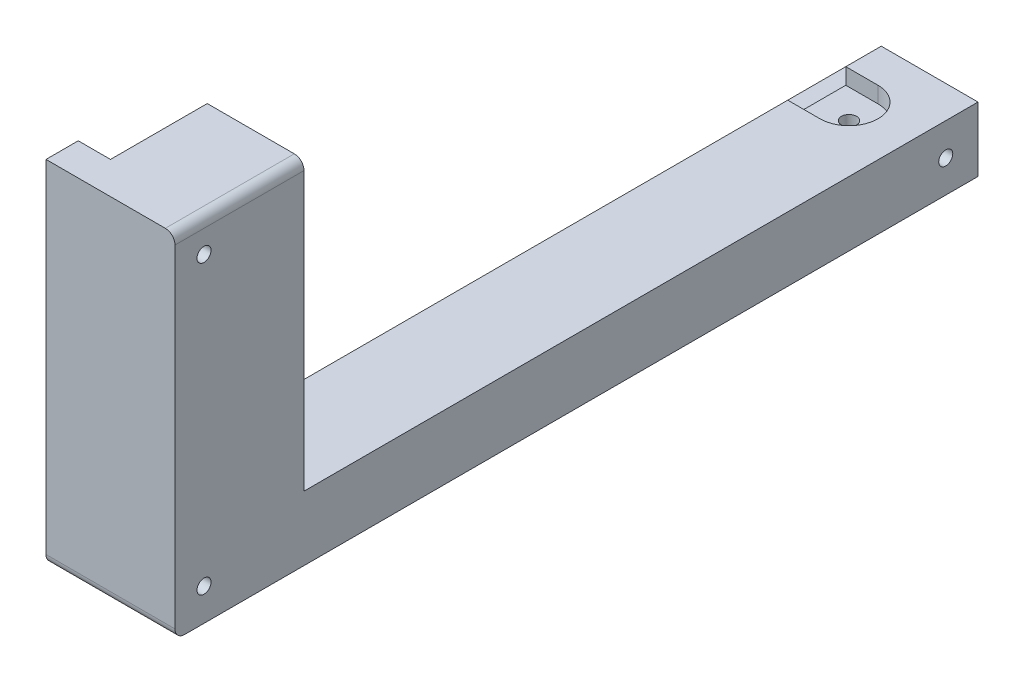
ISO-10303-21;
HEADER;
FILE_DESCRIPTION(('STEP AP214'),'2;1');
FILE_NAME('part.step','',(''),(''),'','','');
FILE_SCHEMA(('AUTOMOTIVE_DESIGN { 1 0 10303 214 1 1 1 1 }'));
ENDSEC;
DATA;
#1=APPLICATION_CONTEXT('core data for automotive mechanical design processes');
#2=APPLICATION_PROTOCOL_DEFINITION('international standard','automotive_design',2000,#1);
#3=PRODUCT_CONTEXT('',#1,'mechanical');
#4=PRODUCT('Part','Part','',(#3));
#5=PRODUCT_RELATED_PRODUCT_CATEGORY('part','',(#4));
#6=PRODUCT_DEFINITION_FORMATION('','',#4);
#7=PRODUCT_DEFINITION_CONTEXT('part definition',#1,'design');
#8=PRODUCT_DEFINITION('design','',#6,#7);
#9=PRODUCT_DEFINITION_SHAPE('','',#8);
#10=(LENGTH_UNIT() NAMED_UNIT(*) SI_UNIT(.MILLI.,.METRE.));
#11=(NAMED_UNIT(*) PLANE_ANGLE_UNIT() SI_UNIT($,.RADIAN.));
#12=(NAMED_UNIT(*) SI_UNIT($,.STERADIAN.) SOLID_ANGLE_UNIT());
#13=UNCERTAINTY_MEASURE_WITH_UNIT(LENGTH_MEASURE(1.E-05),#10,'distance_accuracy_value','');
#14=(GEOMETRIC_REPRESENTATION_CONTEXT(3) GLOBAL_UNCERTAINTY_ASSIGNED_CONTEXT((#13)) GLOBAL_UNIT_ASSIGNED_CONTEXT((#10,
#11,#12)) REPRESENTATION_CONTEXT('',''));
#15=CARTESIAN_POINT('',(0.,0.,0.));
#16=DIRECTION('',(0.,0.,1.));
#17=DIRECTION('',(1.,0.,0.));
#18=AXIS2_PLACEMENT_3D('',#15,#16,#17);
#19=CARTESIAN_POINT('',(0.,-3.00000000000001,105.5));
#20=DIRECTION('',(0.,1.,0.));
#21=DIRECTION('',(0.,0.,1.));
#22=AXIS2_PLACEMENT_3D('',#19,#20,#21);
#23=CYLINDRICAL_SURFACE('',#22,2.35);
#24=CARTESIAN_POINT('',(0.,0.,105.5));
#25=DIRECTION('',(0.,-1.,0.));
#26=DIRECTION('',(0.,0.,-1.));
#27=AXIS2_PLACEMENT_3D('',#24,#25,#26);
#28=CIRCLE('',#27,2.35);
#29=CARTESIAN_POINT('',(0.,0.,103.15));
#30=VERTEX_POINT('',#29);
#31=EDGE_CURVE('E247',#30,#30,#28,.T.);
#32=ORIENTED_EDGE('',*,*,#31,.T.);
#33=EDGE_LOOP('',(#32));
#34=FACE_BOUND('',#33,.T.);
#35=CARTESIAN_POINT('',(0.,15.,105.5));
#36=DIRECTION('',(0.,1.,0.));
#37=DIRECTION('',(0.,0.,1.));
#38=AXIS2_PLACEMENT_3D('',#35,#36,#37);
#39=CIRCLE('',#38,2.35);
#40=CARTESIAN_POINT('',(0.,15.,107.85));
#41=VERTEX_POINT('',#40);
#42=EDGE_CURVE('E245',#41,#41,#39,.F.);
#43=ORIENTED_EDGE('',*,*,#42,.F.);
#44=EDGE_LOOP('',(#43));
#45=FACE_BOUND('',#44,.T.);
#46=ADVANCED_FACE('F37',(#34,#45),#23,.F.);
#47=CARTESIAN_POINT('',(0.,-3.00000000000001,-104.5));
#48=DIRECTION('',(0.,1.,0.));
#49=DIRECTION('',(0.,0.,1.));
#50=AXIS2_PLACEMENT_3D('',#47,#48,#49);
#51=CYLINDRICAL_SURFACE('',#50,2.35);
#52=CARTESIAN_POINT('',(0.,0.,-104.5));
#53=DIRECTION('',(0.,-1.,0.));
#54=DIRECTION('',(0.,0.,-1.));
#55=AXIS2_PLACEMENT_3D('',#52,#53,#54);
#56=CIRCLE('',#55,2.35);
#57=CARTESIAN_POINT('',(0.,0.,-106.85));
#58=VERTEX_POINT('',#57);
#59=EDGE_CURVE('E262',#58,#58,#56,.T.);
#60=ORIENTED_EDGE('',*,*,#59,.T.);
#61=EDGE_LOOP('',(#60));
#62=FACE_BOUND('',#61,.T.);
#63=CARTESIAN_POINT('',(0.,15.,-104.5));
#64=DIRECTION('',(0.,1.,0.));
#65=DIRECTION('',(0.,0.,1.));
#66=AXIS2_PLACEMENT_3D('',#63,#64,#65);
#67=CIRCLE('',#66,2.35);
#68=CARTESIAN_POINT('',(0.,15.,-102.15));
#69=VERTEX_POINT('',#68);
#70=EDGE_CURVE('E220',#69,#69,#67,.F.);
#71=ORIENTED_EDGE('',*,*,#70,.F.);
#72=EDGE_LOOP('',(#71));
#73=FACE_BOUND('',#72,.T.);
#74=ADVANCED_FACE('F426',(#62,#73),#51,.F.);
#75=CARTESIAN_POINT('',(-10.,120.,-124.5));
#76=DIRECTION('',(-1.,0.,0.));
#77=DIRECTION('',(0.,0.,1.));
#78=AXIS2_PLACEMENT_3D('',#75,#76,#77);
#79=PLANE('',#78);
#80=DIRECTION('',(0.,1.,0.));
#81=VECTOR('',#80,1.);
#82=CARTESIAN_POINT('',(-9.99999999999997,15.,-95.5));
#83=LINE('',#82,#81);
#84=CARTESIAN_POINT('',(-9.99999999999997,15.,-95.5));
#85=VERTEX_POINT('',#84);
#86=CARTESIAN_POINT('',(-9.99999999999997,20.,-95.5));
#87=VERTEX_POINT('',#86);
#88=EDGE_CURVE('E221',#85,#87,#83,.T.);
#89=ORIENTED_EDGE('',*,*,#88,.F.);
#90=DIRECTION('',(0.,0.,1.));
#91=VECTOR('',#90,1.);
#92=CARTESIAN_POINT('',(-9.99999999999997,15.,-95.5));
#93=LINE('',#92,#91);
#94=CARTESIAN_POINT('',(-9.99999999999997,15.,-113.5));
#95=VERTEX_POINT('',#94);
#96=EDGE_CURVE('E199',#95,#85,#93,.T.);
#97=ORIENTED_EDGE('',*,*,#96,.F.);
#98=DIRECTION('',(0.,1.,0.));
#99=VECTOR('',#98,1.);
#100=CARTESIAN_POINT('',(-9.99999999999997,15.,-113.5));
#101=LINE('',#100,#99);
#102=CARTESIAN_POINT('',(-9.99999999999997,20.,-113.5));
#103=VERTEX_POINT('',#102);
#104=EDGE_CURVE('E190',#95,#103,#101,.T.);
#105=ORIENTED_EDGE('',*,*,#104,.T.);
#106=DIRECTION('',(0.,0.,-1.));
#107=VECTOR('',#106,1.);
#108=CARTESIAN_POINT('',(-9.99999999999998,20.,0.));
#109=LINE('',#108,#107);
#110=CARTESIAN_POINT('',(-10.,20.,-124.5));
#111=VERTEX_POINT('',#110);
#112=EDGE_CURVE('E292',#103,#111,#109,.T.);
#113=ORIENTED_EDGE('',*,*,#112,.T.);
#114=DIRECTION('',(0.,-1.,0.));
#115=VECTOR('',#114,1.);
#116=CARTESIAN_POINT('',(-10.,120.,-124.5));
#117=LINE('',#116,#115);
#118=CARTESIAN_POINT('',(-10.,10.,-124.5));
#119=VERTEX_POINT('',#118);
#120=EDGE_CURVE('E287',#111,#119,#117,.T.);
#121=ORIENTED_EDGE('',*,*,#120,.T.);
#122=DIRECTION('',(0.,0.,-1.));
#123=VECTOR('',#122,1.);
#124=CARTESIAN_POINT('',(-10.,10.,-124.5));
#125=LINE('',#124,#123);
#126=CARTESIAN_POINT('',(-9.99999999999997,10.,114.5));
#127=VERTEX_POINT('',#126);
#128=EDGE_CURVE('E266',#127,#119,#125,.T.);
#129=ORIENTED_EDGE('',*,*,#128,.F.);
#130=DIRECTION('',(0.,-1.,0.));
#131=VECTOR('',#130,1.);
#132=CARTESIAN_POINT('',(-9.99999999999997,120.,114.5));
#133=LINE('',#132,#131);
#134=CARTESIAN_POINT('',(-9.99999999999997,15.,114.5));
#135=VERTEX_POINT('',#134);
#136=EDGE_CURVE('E281',#135,#127,#133,.T.);
#137=ORIENTED_EDGE('',*,*,#136,.F.);
#138=DIRECTION('',(0.,0.,-1.));
#139=VECTOR('',#138,1.);
#140=CARTESIAN_POINT('',(-10.,15.,-124.5));
#141=LINE('',#140,#139);
#142=CARTESIAN_POINT('',(-9.99999999999997,15.,96.5));
#143=VERTEX_POINT('',#142);
#144=EDGE_CURVE('E241',#135,#143,#141,.T.);
#145=ORIENTED_EDGE('',*,*,#144,.T.);
#146=DIRECTION('',(0.,-1.,0.));
#147=VECTOR('',#146,1.);
#148=CARTESIAN_POINT('',(-9.99999999999997,120.,96.5));
#149=LINE('',#148,#147);
#150=CARTESIAN_POINT('',(-10.,20.,96.5));
#151=VERTEX_POINT('',#150);
#152=EDGE_CURVE('E244',#151,#143,#149,.T.);
#153=ORIENTED_EDGE('',*,*,#152,.F.);
#154=EDGE_CURVE('E294',#151,#87,#109,.T.);
#155=ORIENTED_EDGE('',*,*,#154,.T.);
#156=EDGE_LOOP('',(#89,#97,#105,#113,#121,#129,#137,#145,#153,#155));
#157=FACE_BOUND('',#156,.T.);
#158=ADVANCED_FACE('F391',(#157),#79,.T.);
#159=CARTESIAN_POINT('',(0.,20.,0.));
#160=DIRECTION('',(0.,-1.,0.));
#161=DIRECTION('',(0.,0.,-1.));
#162=AXIS2_PLACEMENT_3D('',#159,#160,#161);
#163=PLANE('',#162);
#164=CARTESIAN_POINT('',(0.,20.,-104.5));
#165=DIRECTION('',(0.,1.,0.));
#166=DIRECTION('',(0.,0.,1.));
#167=AXIS2_PLACEMENT_3D('',#164,#165,#166);
#168=CIRCLE('',#167,8.99999999999999);
#169=CARTESIAN_POINT('',(0.,20.,-95.5));
#170=VERTEX_POINT('',#169);
#171=CARTESIAN_POINT('',(0.,20.,-113.5));
#172=VERTEX_POINT('',#171);
#173=EDGE_CURVE('E187',#170,#172,#168,.T.);
#174=ORIENTED_EDGE('',*,*,#173,.F.);
#175=DIRECTION('',(1.,0.,0.));
#176=VECTOR('',#175,1.);
#177=CARTESIAN_POINT('',(0.,20.,-95.5));
#178=LINE('',#177,#176);
#179=EDGE_CURVE('E204',#87,#170,#178,.T.);
#180=ORIENTED_EDGE('',*,*,#179,.F.);
#181=ORIENTED_EDGE('',*,*,#154,.F.);
#182=DIRECTION('',(-1.,0.,0.));
#183=VECTOR('',#182,1.);
#184=CARTESIAN_POINT('',(0.,20.,96.5));
#185=LINE('',#184,#183);
#186=CARTESIAN_POINT('',(0.,20.,96.5));
#187=VERTEX_POINT('',#186);
#188=EDGE_CURVE('E230',#187,#151,#185,.T.);
#189=ORIENTED_EDGE('',*,*,#188,.F.);
#190=CARTESIAN_POINT('',(0.,20.,105.5));
#191=DIRECTION('',(0.,1.,0.));
#192=DIRECTION('',(0.,0.,1.));
#193=AXIS2_PLACEMENT_3D('',#190,#191,#192);
#194=CIRCLE('',#193,8.99999999999999);
#195=CARTESIAN_POINT('',(0.,20.,114.5));
#196=VERTEX_POINT('',#195);
#197=EDGE_CURVE('E216',#196,#187,#194,.T.);
#198=ORIENTED_EDGE('',*,*,#197,.F.);
#199=DIRECTION('',(-1.,0.,0.));
#200=VECTOR('',#199,1.);
#201=CARTESIAN_POINT('',(10.,20.,114.5));
#202=LINE('',#201,#200);
#203=CARTESIAN_POINT('',(10.,20.,114.5));
#204=VERTEX_POINT('',#203);
#205=EDGE_CURVE('E263',#204,#196,#202,.T.);
#206=ORIENTED_EDGE('',*,*,#205,.F.);
#207=DIRECTION('',(0.,0.,1.));
#208=VECTOR('',#207,1.);
#209=CARTESIAN_POINT('',(10.,20.,114.5));
#210=LINE('',#209,#208);
#211=CARTESIAN_POINT('',(10.,20.,84.5));
#212=VERTEX_POINT('',#211);
#213=EDGE_CURVE('E257',#212,#204,#210,.T.);
#214=ORIENTED_EDGE('',*,*,#213,.F.);
#215=DIRECTION('',(-1.,0.,0.));
#216=VECTOR('',#215,1.);
#217=CARTESIAN_POINT('',(-20.,20.,84.5));
#218=LINE('',#217,#216);
#219=CARTESIAN_POINT('',(20.,20.,84.5));
#220=VERTEX_POINT('',#219);
#221=EDGE_CURVE('E298',#220,#212,#218,.T.);
#222=ORIENTED_EDGE('',*,*,#221,.F.);
#223=DIRECTION('',(0.,0.,-1.));
#224=VECTOR('',#223,1.);
#225=CARTESIAN_POINT('',(20.,20.,124.5));
#226=LINE('',#225,#224);
#227=CARTESIAN_POINT('',(20.,20.,-124.5));
#228=VERTEX_POINT('',#227);
#229=EDGE_CURVE('E308',#220,#228,#226,.T.);
#230=ORIENTED_EDGE('',*,*,#229,.T.);
#231=DIRECTION('',(-1.,0.,0.));
#232=VECTOR('',#231,1.);
#233=CARTESIAN_POINT('',(-20.,20.,-124.5));
#234=LINE('',#233,#232);
#235=EDGE_CURVE('E310',#228,#111,#234,.T.);
#236=ORIENTED_EDGE('',*,*,#235,.T.);
#237=ORIENTED_EDGE('',*,*,#112,.F.);
#238=DIRECTION('',(-1.,0.,0.));
#239=VECTOR('',#238,1.);
#240=CARTESIAN_POINT('',(-9.99999999999997,20.,-113.5));
#241=LINE('',#240,#239);
#242=EDGE_CURVE('E207',#172,#103,#241,.T.);
#243=ORIENTED_EDGE('',*,*,#242,.F.);
#244=EDGE_LOOP('',(#174,#180,#181,#189,#198,#206,#214,#222,#230,#236,#237,#243));
#245=FACE_BOUND('',#244,.T.);
#246=ADVANCED_FACE('F380',(#245),#163,.F.);
#247=CARTESIAN_POINT('',(-20.,20.,-124.5));
#248=DIRECTION('',(0.,0.,1.));
#249=DIRECTION('',(1.,0.,0.));
#250=AXIS2_PLACEMENT_3D('',#247,#248,#249);
#251=PLANE('',#250);
#252=ORIENTED_EDGE('',*,*,#120,.F.);
#253=ORIENTED_EDGE('',*,*,#235,.F.);
#254=DIRECTION('',(0.,-1.,0.));
#255=VECTOR('',#254,1.);
#256=CARTESIAN_POINT('',(20.,20.,-124.5));
#257=LINE('',#256,#255);
#258=CARTESIAN_POINT('',(20.,0.,-124.5));
#259=VERTEX_POINT('',#258);
#260=EDGE_CURVE('E326',#228,#259,#257,.T.);
#261=ORIENTED_EDGE('',*,*,#260,.T.);
#262=DIRECTION('',(-1.,0.,0.));
#263=VECTOR('',#262,1.);
#264=CARTESIAN_POINT('',(-20.,0.,-124.5));
#265=LINE('',#264,#263);
#266=CARTESIAN_POINT('',(-20.,0.,-124.5));
#267=VERTEX_POINT('',#266);
#268=EDGE_CURVE('E316',#259,#267,#265,.T.);
#269=ORIENTED_EDGE('',*,*,#268,.T.);
#270=DIRECTION('',(0.,-1.,0.));
#271=VECTOR('',#270,1.);
#272=CARTESIAN_POINT('',(-20.,20.,-124.5));
#273=LINE('',#272,#271);
#274=CARTESIAN_POINT('',(-20.,10.,-124.5));
#275=VERTEX_POINT('',#274);
#276=EDGE_CURVE('E324',#275,#267,#273,.T.);
#277=ORIENTED_EDGE('',*,*,#276,.F.);
#278=DIRECTION('',(-1.,0.,0.));
#279=VECTOR('',#278,1.);
#280=CARTESIAN_POINT('',(-10.,10.,-124.5));
#281=LINE('',#280,#279);
#282=EDGE_CURVE('E273',#119,#275,#281,.T.);
#283=ORIENTED_EDGE('',*,*,#282,.F.);
#284=EDGE_LOOP('',(#252,#253,#261,#269,#277,#283));
#285=FACE_BOUND('',#284,.T.);
#286=ADVANCED_FACE('F385',(#285),#251,.F.);
#287=CARTESIAN_POINT('',(-20.,20.,124.5));
#288=DIRECTION('',(1.,0.,0.));
#289=DIRECTION('',(0.,0.,-1.));
#290=AXIS2_PLACEMENT_3D('',#287,#288,#289);
#291=PLANE('',#290);
#292=DIRECTION('',(0.,0.,1.));
#293=VECTOR('',#292,1.);
#294=CARTESIAN_POINT('',(-20.,0.,124.5));
#295=LINE('',#294,#293);
#296=CARTESIAN_POINT('',(-20.,0.,121.5));
#297=VERTEX_POINT('',#296);
#298=EDGE_CURVE('E311',#267,#297,#295,.T.);
#299=ORIENTED_EDGE('',*,*,#298,.T.);
#300=CARTESIAN_POINT('',(-20.,3.,121.5));
#301=DIRECTION('',(1.,0.,0.));
#302=DIRECTION('',(0.,0.,-1.));
#303=AXIS2_PLACEMENT_3D('',#300,#301,#302);
#304=CIRCLE('',#303,3.);
#305=CARTESIAN_POINT('',(-20.,3.,124.5));
#306=VERTEX_POINT('',#305);
#307=EDGE_CURVE('E11',#297,#306,#304,.F.);
#308=ORIENTED_EDGE('',*,*,#307,.T.);
#309=DIRECTION('',(0.,-1.,0.));
#310=VECTOR('',#309,1.);
#311=CARTESIAN_POINT('',(-20.,20.,124.5));
#312=LINE('',#311,#310);
#313=CARTESIAN_POINT('',(-20.,109.09,124.5));
#314=VERTEX_POINT('',#313);
#315=EDGE_CURVE('E322',#314,#306,#312,.T.);
#316=ORIENTED_EDGE('',*,*,#315,.F.);
#317=DIRECTION('',(0.,0.,1.));
#318=VECTOR('',#317,1.);
#319=CARTESIAN_POINT('',(-20.,109.09,124.5));
#320=LINE('',#319,#318);
#321=CARTESIAN_POINT('',(-20.,109.09,114.5));
#322=VERTEX_POINT('',#321);
#323=EDGE_CURVE('E295',#322,#314,#320,.T.);
#324=ORIENTED_EDGE('',*,*,#323,.F.);
#325=DIRECTION('',(0.,-1.,0.));
#326=VECTOR('',#325,1.);
#327=CARTESIAN_POINT('',(-20.,120.,114.5));
#328=LINE('',#327,#326);
#329=CARTESIAN_POINT('',(-20.,10.,114.5));
#330=VERTEX_POINT('',#329);
#331=EDGE_CURVE('E285',#322,#330,#328,.T.);
#332=ORIENTED_EDGE('',*,*,#331,.T.);
#333=DIRECTION('',(0.,0.,1.));
#334=VECTOR('',#333,1.);
#335=CARTESIAN_POINT('',(-20.,10.,-124.5));
#336=LINE('',#335,#334);
#337=EDGE_CURVE('E275',#275,#330,#336,.T.);
#338=ORIENTED_EDGE('',*,*,#337,.F.);
#339=ORIENTED_EDGE('',*,*,#276,.T.);
#340=EDGE_LOOP('',(#299,#308,#316,#324,#332,#338,#339));
#341=FACE_BOUND('',#340,.T.);
#342=ADVANCED_FACE('F458',(#341),#291,.F.);
#343=CARTESIAN_POINT('',(-20.,109.09,84.5));
#344=DIRECTION('',(0.,0.,1.));
#345=DIRECTION('',(1.,0.,0.));
#346=AXIS2_PLACEMENT_3D('',#343,#344,#345);
#347=PLANE('',#346);
#348=DIRECTION('',(-1.,0.,0.));
#349=VECTOR('',#348,1.);
#350=CARTESIAN_POINT('',(-20.,109.09,84.5));
#351=LINE('',#350,#349);
#352=CARTESIAN_POINT('',(17.,109.09,84.5));
#353=VERTEX_POINT('',#352);
#354=CARTESIAN_POINT('',(-9.99999999999997,109.09,84.5));
#355=VERTEX_POINT('',#354);
#356=EDGE_CURVE('E301',#353,#355,#351,.T.);
#357=ORIENTED_EDGE('',*,*,#356,.F.);
#358=CARTESIAN_POINT('',(17.,106.09,84.5));
#359=DIRECTION('',(0.,0.,1.));
#360=DIRECTION('',(1.,0.,0.));
#361=AXIS2_PLACEMENT_3D('',#358,#359,#360);
#362=CIRCLE('',#361,3.);
#363=CARTESIAN_POINT('',(20.,106.09,84.5));
#364=VERTEX_POINT('',#363);
#365=EDGE_CURVE('E345',#353,#364,#362,.F.);
#366=ORIENTED_EDGE('',*,*,#365,.T.);
#367=DIRECTION('',(0.,-1.,0.));
#368=VECTOR('',#367,1.);
#369=CARTESIAN_POINT('',(20.,109.09,84.5));
#370=LINE('',#369,#368);
#371=EDGE_CURVE('E303',#364,#220,#370,.T.);
#372=ORIENTED_EDGE('',*,*,#371,.T.);
#373=ORIENTED_EDGE('',*,*,#221,.T.);
#374=DIRECTION('',(0.,-1.,0.));
#375=VECTOR('',#374,1.);
#376=CARTESIAN_POINT('',(10.,20.,84.5));
#377=LINE('',#376,#375);
#378=CARTESIAN_POINT('',(10.,40.,84.4999999999999));
#379=VERTEX_POINT('',#378);
#380=EDGE_CURVE('E255',#379,#212,#377,.T.);
#381=ORIENTED_EDGE('',*,*,#380,.F.);
#382=DIRECTION('',(-1.,0.,0.));
#383=VECTOR('',#382,1.);
#384=CARTESIAN_POINT('',(10.,40.,84.4999999999999));
#385=LINE('',#384,#383);
#386=CARTESIAN_POINT('',(-9.99999999999997,40.,84.4999999999999));
#387=VERTEX_POINT('',#386);
#388=EDGE_CURVE('E267',#379,#387,#385,.T.);
#389=ORIENTED_EDGE('',*,*,#388,.T.);
#390=DIRECTION('',(0.,-1.,0.));
#391=VECTOR('',#390,1.);
#392=CARTESIAN_POINT('',(-9.99999999999997,109.09,84.5));
#393=LINE('',#392,#391);
#394=EDGE_CURVE('E289',#355,#387,#393,.T.);
#395=ORIENTED_EDGE('',*,*,#394,.F.);
#396=EDGE_LOOP('',(#357,#366,#372,#373,#381,#389,#395));
#397=FACE_BOUND('',#396,.T.);
#398=ADVANCED_FACE('F371',(#397),#347,.F.);
#399=CARTESIAN_POINT('',(0.,109.09,0.));
#400=DIRECTION('',(0.,-1.,0.));
#401=DIRECTION('',(0.,0.,-1.));
#402=AXIS2_PLACEMENT_3D('',#399,#400,#401);
#403=PLANE('',#402);
#404=DIRECTION('',(1.,0.,0.));
#405=VECTOR('',#404,1.);
#406=CARTESIAN_POINT('',(-20.,109.09,124.5));
#407=LINE('',#406,#405);
#408=CARTESIAN_POINT('',(17.,109.09,124.5));
#409=VERTEX_POINT('',#408);
#410=EDGE_CURVE('E297',#314,#409,#407,.T.);
#411=ORIENTED_EDGE('',*,*,#410,.T.);
#412=DIRECTION('',(0.,0.,-1.));
#413=VECTOR('',#412,1.);
#414=CARTESIAN_POINT('',(17.,109.09,0.));
#415=LINE('',#414,#413);
#416=EDGE_CURVE('E334',#409,#353,#415,.T.);
#417=ORIENTED_EDGE('',*,*,#416,.T.);
#418=ORIENTED_EDGE('',*,*,#356,.T.);
#419=DIRECTION('',(0.,0.,-1.));
#420=VECTOR('',#419,1.);
#421=CARTESIAN_POINT('',(-9.99999999999998,109.09,0.));
#422=LINE('',#421,#420);
#423=CARTESIAN_POINT('',(-9.99999999999997,109.09,114.5));
#424=VERTEX_POINT('',#423);
#425=EDGE_CURVE('E331',#424,#355,#422,.T.);
#426=ORIENTED_EDGE('',*,*,#425,.F.);
#427=DIRECTION('',(1.,0.,0.));
#428=VECTOR('',#427,1.);
#429=CARTESIAN_POINT('',(0.,109.09,114.5));
#430=LINE('',#429,#428);
#431=EDGE_CURVE('E329',#322,#424,#430,.T.);
#432=ORIENTED_EDGE('',*,*,#431,.F.);
#433=ORIENTED_EDGE('',*,*,#323,.T.);
#434=EDGE_LOOP('',(#411,#417,#418,#426,#432,#433));
#435=FACE_BOUND('',#434,.T.);
#436=ADVANCED_FACE('F364',(#435),#403,.F.);
#437=CARTESIAN_POINT('',(20.,20.,124.5));
#438=DIRECTION('',(-1.,0.,0.));
#439=DIRECTION('',(0.,0.,1.));
#440=AXIS2_PLACEMENT_3D('',#437,#438,#439);
#441=PLANE('',#440);
#442=CARTESIAN_POINT('',(20.,10.,-114.5));
#443=DIRECTION('',(1.,0.,0.));
#444=DIRECTION('',(0.,0.,-1.));
#445=AXIS2_PLACEMENT_3D('',#442,#443,#444);
#446=CIRCLE('',#445,2.175);
#447=CARTESIAN_POINT('',(20.,10.,-116.675));
#448=VERTEX_POINT('',#447);
#449=EDGE_CURVE('E792',#448,#448,#446,.T.);
#450=ORIENTED_EDGE('',*,*,#449,.F.);
#451=EDGE_LOOP('',(#450));
#452=FACE_BOUND('',#451,.T.);
#453=CARTESIAN_POINT('',(20.,10.,115.5));
#454=DIRECTION('',(1.,0.,0.));
#455=DIRECTION('',(0.,0.,-1.));
#456=AXIS2_PLACEMENT_3D('',#453,#454,#455);
#457=CIRCLE('',#456,2.175);
#458=CARTESIAN_POINT('',(20.,10.,113.325));
#459=VERTEX_POINT('',#458);
#460=EDGE_CURVE('E787',#459,#459,#457,.T.);
#461=ORIENTED_EDGE('',*,*,#460,.F.);
#462=EDGE_LOOP('',(#461));
#463=FACE_BOUND('',#462,.T.);
#464=CARTESIAN_POINT('',(20.,99.09,115.5));
#465=DIRECTION('',(1.,0.,0.));
#466=DIRECTION('',(0.,0.,-1.));
#467=AXIS2_PLACEMENT_3D('',#464,#465,#466);
#468=CIRCLE('',#467,2.175);
#469=CARTESIAN_POINT('',(20.,99.09,113.325));
#470=VERTEX_POINT('',#469);
#471=EDGE_CURVE('E781',#470,#470,#468,.T.);
#472=ORIENTED_EDGE('',*,*,#471,.F.);
#473=EDGE_LOOP('',(#472));
#474=FACE_BOUND('',#473,.T.);
#475=ORIENTED_EDGE('',*,*,#371,.F.);
#476=DIRECTION('',(0.,0.,-1.));
#477=VECTOR('',#476,1.);
#478=CARTESIAN_POINT('',(20.,106.09,124.5));
#479=LINE('',#478,#477);
#480=CARTESIAN_POINT('',(20.,106.09,124.5));
#481=VERTEX_POINT('',#480);
#482=EDGE_CURVE('E349',#364,#481,#479,.F.);
#483=ORIENTED_EDGE('',*,*,#482,.T.);
#484=DIRECTION('',(0.,-1.,0.));
#485=VECTOR('',#484,1.);
#486=CARTESIAN_POINT('',(20.,20.,124.5));
#487=LINE('',#486,#485);
#488=CARTESIAN_POINT('',(20.,3.,124.5));
#489=VERTEX_POINT('',#488);
#490=EDGE_CURVE('E314',#481,#489,#487,.T.);
#491=ORIENTED_EDGE('',*,*,#490,.T.);
#492=CARTESIAN_POINT('',(20.,3.,121.5));
#493=DIRECTION('',(-1.,0.,0.));
#494=DIRECTION('',(0.,0.,1.));
#495=AXIS2_PLACEMENT_3D('',#492,#493,#494);
#496=CIRCLE('',#495,3.);
#497=CARTESIAN_POINT('',(20.,0.,121.5));
#498=VERTEX_POINT('',#497);
#499=EDGE_CURVE('E347',#489,#498,#496,.F.);
#500=ORIENTED_EDGE('',*,*,#499,.T.);
#501=DIRECTION('',(0.,0.,-1.));
#502=VECTOR('',#501,1.);
#503=CARTESIAN_POINT('',(20.,0.,124.5));
#504=LINE('',#503,#502);
#505=EDGE_CURVE('E307',#498,#259,#504,.T.);
#506=ORIENTED_EDGE('',*,*,#505,.T.);
#507=ORIENTED_EDGE('',*,*,#260,.F.);
#508=ORIENTED_EDGE('',*,*,#229,.F.);
#509=EDGE_LOOP('',(#475,#483,#491,#500,#506,#507,#508));
#510=FACE_BOUND('',#509,.T.);
#511=ADVANCED_FACE('F376',(#452,#463,#474,#510),#441,.F.);
#512=CARTESIAN_POINT('',(-20.,20.,124.5));
#513=DIRECTION('',(0.,0.,-1.));
#514=DIRECTION('',(-1.,0.,0.));
#515=AXIS2_PLACEMENT_3D('',#512,#513,#514);
#516=PLANE('',#515);
#517=ORIENTED_EDGE('',*,*,#490,.F.);
#518=CARTESIAN_POINT('',(17.,106.09,124.5));
#519=DIRECTION('',(0.,0.,-1.));
#520=DIRECTION('',(-1.,0.,0.));
#521=AXIS2_PLACEMENT_3D('',#518,#519,#520);
#522=CIRCLE('',#521,3.);
#523=EDGE_CURVE('E354',#481,#409,#522,.F.);
#524=ORIENTED_EDGE('',*,*,#523,.T.);
#525=ORIENTED_EDGE('',*,*,#410,.F.);
#526=ORIENTED_EDGE('',*,*,#315,.T.);
#527=DIRECTION('',(1.,0.,0.));
#528=VECTOR('',#527,1.);
#529=CARTESIAN_POINT('',(20.,3.,124.5));
#530=LINE('',#529,#528);
#531=EDGE_CURVE('E351',#306,#489,#530,.T.);
#532=ORIENTED_EDGE('',*,*,#531,.T.);
#533=EDGE_LOOP('',(#517,#524,#525,#526,#532));
#534=FACE_BOUND('',#533,.T.);
#535=ADVANCED_FACE('F359',(#534),#516,.F.);
#536=CARTESIAN_POINT('',(0.,0.,0.));
#537=DIRECTION('',(0.,-1.,0.));
#538=DIRECTION('',(0.,0.,-1.));
#539=AXIS2_PLACEMENT_3D('',#536,#537,#538);
#540=PLANE('',#539);
#541=ORIENTED_EDGE('',*,*,#59,.F.);
#542=EDGE_LOOP('',(#541));
#543=FACE_BOUND('',#542,.T.);
#544=ORIENTED_EDGE('',*,*,#31,.F.);
#545=EDGE_LOOP('',(#544));
#546=FACE_BOUND('',#545,.T.);
#547=ORIENTED_EDGE('',*,*,#505,.F.);
#548=DIRECTION('',(1.,0.,0.));
#549=VECTOR('',#548,1.);
#550=CARTESIAN_POINT('',(-20.,0.,121.5));
#551=LINE('',#550,#549);
#552=EDGE_CURVE('E45',#498,#297,#551,.F.);
#553=ORIENTED_EDGE('',*,*,#552,.T.);
#554=ORIENTED_EDGE('',*,*,#298,.F.);
#555=ORIENTED_EDGE('',*,*,#268,.F.);
#556=EDGE_LOOP('',(#547,#553,#554,#555));
#557=FACE_BOUND('',#556,.T.);
#558=ADVANCED_FACE('F452',(#543,#546,#557),#540,.T.);
#559=DIRECTION('',(0.,0.,-1.));
#560=VECTOR('',#559,1.);
#561=CARTESIAN_POINT('',(-9.99999999999997,40.,114.5));
#562=LINE('',#561,#560);
#563=CARTESIAN_POINT('',(-9.99999999999997,40.,114.5));
#564=VERTEX_POINT('',#563);
#565=EDGE_CURVE('E252',#564,#387,#562,.T.);
#566=ORIENTED_EDGE('',*,*,#565,.F.);
#567=EDGE_CURVE('E282',#424,#564,#133,.T.);
#568=ORIENTED_EDGE('',*,*,#567,.F.);
#569=ORIENTED_EDGE('',*,*,#425,.T.);
#570=ORIENTED_EDGE('',*,*,#394,.T.);
#571=EDGE_LOOP('',(#566,#568,#569,#570));
#572=FACE_BOUND('',#571,.T.);
#573=ADVANCED_FACE('F449',(#572),#79,.T.);
#574=CARTESIAN_POINT('',(-9.99999999999997,120.,114.5));
#575=DIRECTION('',(0.,0.,-1.));
#576=DIRECTION('',(-1.,0.,0.));
#577=AXIS2_PLACEMENT_3D('',#574,#575,#576);
#578=PLANE('',#577);
#579=DIRECTION('',(1.,0.,0.));
#580=VECTOR('',#579,1.);
#581=CARTESIAN_POINT('',(-20.,15.,114.5));
#582=LINE('',#581,#580);
#583=CARTESIAN_POINT('',(0.,15.,114.5));
#584=VERTEX_POINT('',#583);
#585=EDGE_CURVE('E232',#135,#584,#582,.T.);
#586=ORIENTED_EDGE('',*,*,#585,.F.);
#587=ORIENTED_EDGE('',*,*,#136,.T.);
#588=DIRECTION('',(1.,0.,0.));
#589=VECTOR('',#588,1.);
#590=CARTESIAN_POINT('',(-9.99999999999997,10.,114.5));
#591=LINE('',#590,#589);
#592=EDGE_CURVE('E278',#330,#127,#591,.T.);
#593=ORIENTED_EDGE('',*,*,#592,.F.);
#594=ORIENTED_EDGE('',*,*,#331,.F.);
#595=ORIENTED_EDGE('',*,*,#431,.T.);
#596=ORIENTED_EDGE('',*,*,#567,.T.);
#597=DIRECTION('',(-1.,0.,0.));
#598=VECTOR('',#597,1.);
#599=CARTESIAN_POINT('',(10.,40.,114.5));
#600=LINE('',#599,#598);
#601=CARTESIAN_POINT('',(10.,40.,114.5));
#602=VERTEX_POINT('',#601);
#603=EDGE_CURVE('E260',#602,#564,#600,.T.);
#604=ORIENTED_EDGE('',*,*,#603,.F.);
#605=DIRECTION('',(0.,1.,0.));
#606=VECTOR('',#605,1.);
#607=CARTESIAN_POINT('',(10.,20.,114.5));
#608=LINE('',#607,#606);
#609=EDGE_CURVE('E248',#204,#602,#608,.T.);
#610=ORIENTED_EDGE('',*,*,#609,.F.);
#611=ORIENTED_EDGE('',*,*,#205,.T.);
#612=DIRECTION('',(0.,1.,0.));
#613=VECTOR('',#612,1.);
#614=CARTESIAN_POINT('',(0.,15.,114.5));
#615=LINE('',#614,#613);
#616=EDGE_CURVE('E224',#584,#196,#615,.T.);
#617=ORIENTED_EDGE('',*,*,#616,.F.);
#618=EDGE_LOOP('',(#586,#587,#593,#594,#595,#596,#604,#610,#611,#617));
#619=FACE_BOUND('',#618,.T.);
#620=ADVANCED_FACE('F399',(#619),#578,.T.);
#621=CARTESIAN_POINT('',(0.,10.,0.));
#622=DIRECTION('',(0.,-1.,0.));
#623=DIRECTION('',(0.,0.,-1.));
#624=AXIS2_PLACEMENT_3D('',#621,#622,#623);
#625=PLANE('',#624);
#626=ORIENTED_EDGE('',*,*,#128,.T.);
#627=ORIENTED_EDGE('',*,*,#282,.T.);
#628=ORIENTED_EDGE('',*,*,#337,.T.);
#629=ORIENTED_EDGE('',*,*,#592,.T.);
#630=EDGE_LOOP('',(#626,#627,#628,#629));
#631=FACE_BOUND('',#630,.T.);
#632=ADVANCED_FACE('F394',(#631),#625,.F.);
#633=CARTESIAN_POINT('',(10.,40.,114.5));
#634=DIRECTION('',(0.,1.,0.));
#635=DIRECTION('',(0.,0.,1.));
#636=AXIS2_PLACEMENT_3D('',#633,#634,#635);
#637=PLANE('',#636);
#638=ORIENTED_EDGE('',*,*,#565,.T.);
#639=ORIENTED_EDGE('',*,*,#388,.F.);
#640=DIRECTION('',(0.,0.,-1.));
#641=VECTOR('',#640,1.);
#642=CARTESIAN_POINT('',(10.,40.,114.5));
#643=LINE('',#642,#641);
#644=EDGE_CURVE('E251',#602,#379,#643,.T.);
#645=ORIENTED_EDGE('',*,*,#644,.F.);
#646=ORIENTED_EDGE('',*,*,#603,.T.);
#647=EDGE_LOOP('',(#638,#639,#645,#646));
#648=FACE_BOUND('',#647,.T.);
#649=ADVANCED_FACE('F440',(#648),#637,.F.);
#650=CARTESIAN_POINT('',(10.,0.,0.));
#651=DIRECTION('',(-1.,0.,0.));
#652=DIRECTION('',(0.,0.,1.));
#653=AXIS2_PLACEMENT_3D('',#650,#651,#652);
#654=PLANE('',#653);
#655=ORIENTED_EDGE('',*,*,#609,.T.);
#656=ORIENTED_EDGE('',*,*,#644,.T.);
#657=ORIENTED_EDGE('',*,*,#380,.T.);
#658=ORIENTED_EDGE('',*,*,#213,.T.);
#659=EDGE_LOOP('',(#655,#656,#657,#658));
#660=FACE_BOUND('',#659,.T.);
#661=ADVANCED_FACE('F437',(#660),#654,.T.);
#662=CARTESIAN_POINT('',(0.,15.,-104.5));
#663=DIRECTION('',(0.,1.,0.));
#664=DIRECTION('',(0.,0.,1.));
#665=AXIS2_PLACEMENT_3D('',#662,#663,#664);
#666=PLANE('',#665);
#667=CARTESIAN_POINT('',(0.,15.,-104.5));
#668=DIRECTION('',(0.,1.,0.));
#669=DIRECTION('',(0.,0.,1.));
#670=AXIS2_PLACEMENT_3D('',#667,#668,#669);
#671=CIRCLE('',#670,8.99999999999999);
#672=CARTESIAN_POINT('',(0.,15.,-95.5));
#673=VERTEX_POINT('',#672);
#674=CARTESIAN_POINT('',(0.,15.,-113.5));
#675=VERTEX_POINT('',#674);
#676=EDGE_CURVE('E184',#673,#675,#671,.T.);
#677=ORIENTED_EDGE('',*,*,#676,.T.);
#678=DIRECTION('',(-1.,0.,0.));
#679=VECTOR('',#678,1.);
#680=CARTESIAN_POINT('',(-9.99999999999997,15.,-113.5));
#681=LINE('',#680,#679);
#682=EDGE_CURVE('E194',#675,#95,#681,.T.);
#683=ORIENTED_EDGE('',*,*,#682,.T.);
#684=ORIENTED_EDGE('',*,*,#96,.T.);
#685=DIRECTION('',(1.,0.,0.));
#686=VECTOR('',#685,1.);
#687=CARTESIAN_POINT('',(0.,15.,-95.5));
#688=LINE('',#687,#686);
#689=EDGE_CURVE('E191',#85,#673,#688,.T.);
#690=ORIENTED_EDGE('',*,*,#689,.T.);
#691=EDGE_LOOP('',(#677,#683,#684,#690));
#692=FACE_BOUND('',#691,.T.);
#693=ORIENTED_EDGE('',*,*,#70,.T.);
#694=EDGE_LOOP('',(#693));
#695=FACE_BOUND('',#694,.T.);
#696=ADVANCED_FACE('F201',(#692,#695),#666,.T.);
#697=CARTESIAN_POINT('',(0.,15.,-104.5));
#698=DIRECTION('',(0.,1.,0.));
#699=DIRECTION('',(0.,0.,1.));
#700=AXIS2_PLACEMENT_3D('',#697,#698,#699);
#701=CYLINDRICAL_SURFACE('',#700,8.99999999999999);
#702=ORIENTED_EDGE('',*,*,#173,.T.);
#703=DIRECTION('',(0.,1.,0.));
#704=VECTOR('',#703,1.);
#705=CARTESIAN_POINT('',(0.,15.,-113.5));
#706=LINE('',#705,#704);
#707=EDGE_CURVE('E180',#675,#172,#706,.T.);
#708=ORIENTED_EDGE('',*,*,#707,.F.);
#709=ORIENTED_EDGE('',*,*,#676,.F.);
#710=DIRECTION('',(0.,1.,0.));
#711=VECTOR('',#710,1.);
#712=CARTESIAN_POINT('',(0.,15.,-95.5));
#713=LINE('',#712,#711);
#714=EDGE_CURVE('E218',#673,#170,#713,.T.);
#715=ORIENTED_EDGE('',*,*,#714,.T.);
#716=EDGE_LOOP('',(#702,#708,#709,#715));
#717=FACE_BOUND('',#716,.T.);
#718=ADVANCED_FACE('F182',(#717),#701,.F.);
#719=CARTESIAN_POINT('',(0.,15.,-95.5));
#720=DIRECTION('',(0.,0.,1.));
#721=DIRECTION('',(1.,0.,0.));
#722=AXIS2_PLACEMENT_3D('',#719,#720,#721);
#723=PLANE('',#722);
#724=ORIENTED_EDGE('',*,*,#179,.T.);
#725=ORIENTED_EDGE('',*,*,#714,.F.);
#726=ORIENTED_EDGE('',*,*,#689,.F.);
#727=ORIENTED_EDGE('',*,*,#88,.T.);
#728=EDGE_LOOP('',(#724,#725,#726,#727));
#729=FACE_BOUND('',#728,.T.);
#730=ADVANCED_FACE('F415',(#729),#723,.F.);
#731=CARTESIAN_POINT('',(-9.99999999999997,15.,-113.5));
#732=DIRECTION('',(0.,0.,-1.));
#733=DIRECTION('',(-1.,0.,0.));
#734=AXIS2_PLACEMENT_3D('',#731,#732,#733);
#735=PLANE('',#734);
#736=ORIENTED_EDGE('',*,*,#242,.T.);
#737=ORIENTED_EDGE('',*,*,#104,.F.);
#738=ORIENTED_EDGE('',*,*,#682,.F.);
#739=ORIENTED_EDGE('',*,*,#707,.T.);
#740=EDGE_LOOP('',(#736,#737,#738,#739));
#741=FACE_BOUND('',#740,.T.);
#742=ADVANCED_FACE('F195',(#741),#735,.F.);
#743=CARTESIAN_POINT('',(0.,15.,105.5));
#744=DIRECTION('',(0.,1.,0.));
#745=DIRECTION('',(0.,0.,1.));
#746=AXIS2_PLACEMENT_3D('',#743,#744,#745);
#747=PLANE('',#746);
#748=ORIENTED_EDGE('',*,*,#585,.T.);
#749=CARTESIAN_POINT('',(0.,15.,105.5));
#750=DIRECTION('',(0.,1.,0.));
#751=DIRECTION('',(0.,0.,1.));
#752=AXIS2_PLACEMENT_3D('',#749,#750,#751);
#753=CIRCLE('',#752,8.99999999999999);
#754=CARTESIAN_POINT('',(0.,15.,96.5));
#755=VERTEX_POINT('',#754);
#756=EDGE_CURVE('E237',#584,#755,#753,.T.);
#757=ORIENTED_EDGE('',*,*,#756,.T.);
#758=DIRECTION('',(-1.,0.,0.));
#759=VECTOR('',#758,1.);
#760=CARTESIAN_POINT('',(0.,15.,96.5));
#761=LINE('',#760,#759);
#762=EDGE_CURVE('E226',#755,#143,#761,.T.);
#763=ORIENTED_EDGE('',*,*,#762,.T.);
#764=ORIENTED_EDGE('',*,*,#144,.F.);
#765=EDGE_LOOP('',(#748,#757,#763,#764));
#766=FACE_BOUND('',#765,.T.);
#767=ORIENTED_EDGE('',*,*,#42,.T.);
#768=EDGE_LOOP('',(#767));
#769=FACE_BOUND('',#768,.T.);
#770=ADVANCED_FACE('F405',(#766,#769),#747,.T.);
#771=CARTESIAN_POINT('',(0.,15.,96.5));
#772=DIRECTION('',(0.,0.,-1.));
#773=DIRECTION('',(-1.,0.,0.));
#774=AXIS2_PLACEMENT_3D('',#771,#772,#773);
#775=PLANE('',#774);
#776=ORIENTED_EDGE('',*,*,#152,.T.);
#777=ORIENTED_EDGE('',*,*,#762,.F.);
#778=DIRECTION('',(0.,1.,0.));
#779=VECTOR('',#778,1.);
#780=CARTESIAN_POINT('',(0.,15.,96.5));
#781=LINE('',#780,#779);
#782=EDGE_CURVE('E227',#755,#187,#781,.T.);
#783=ORIENTED_EDGE('',*,*,#782,.T.);
#784=ORIENTED_EDGE('',*,*,#188,.T.);
#785=EDGE_LOOP('',(#776,#777,#783,#784));
#786=FACE_BOUND('',#785,.T.);
#787=ADVANCED_FACE('F410',(#786),#775,.F.);
#788=CARTESIAN_POINT('',(0.,15.,105.5));
#789=DIRECTION('',(0.,1.,0.));
#790=DIRECTION('',(0.,0.,1.));
#791=AXIS2_PLACEMENT_3D('',#788,#789,#790);
#792=CYLINDRICAL_SURFACE('',#791,8.99999999999999);
#793=ORIENTED_EDGE('',*,*,#197,.T.);
#794=ORIENTED_EDGE('',*,*,#782,.F.);
#795=ORIENTED_EDGE('',*,*,#756,.F.);
#796=ORIENTED_EDGE('',*,*,#616,.T.);
#797=EDGE_LOOP('',(#793,#794,#795,#796));
#798=FACE_BOUND('',#797,.T.);
#799=ADVANCED_FACE('F501',(#798),#792,.F.);
#800=CARTESIAN_POINT('',(12.,99.09,115.5));
#801=DIRECTION('',(1.,0.,0.));
#802=DIRECTION('',(0.,0.,-1.));
#803=AXIS2_PLACEMENT_3D('',#800,#801,#802);
#804=CYLINDRICAL_SURFACE('',#803,2.175);
#805=CARTESIAN_POINT('',(12.,99.09,115.5));
#806=DIRECTION('',(1.,0.,0.));
#807=DIRECTION('',(0.,0.,-1.));
#808=AXIS2_PLACEMENT_3D('',#805,#806,#807);
#809=CIRCLE('',#808,2.175);
#810=CARTESIAN_POINT('',(12.,99.09,113.325));
#811=VERTEX_POINT('',#810);
#812=EDGE_CURVE('E210',#811,#811,#809,.T.);
#813=ORIENTED_EDGE('',*,*,#812,.F.);
#814=EDGE_LOOP('',(#813));
#815=FACE_BOUND('',#814,.T.);
#816=ORIENTED_EDGE('',*,*,#471,.T.);
#817=EDGE_LOOP('',(#816));
#818=FACE_BOUND('',#817,.T.);
#819=ADVANCED_FACE('F498',(#815,#818),#804,.F.);
#820=CARTESIAN_POINT('',(12.,99.09,115.5));
#821=DIRECTION('',(1.,0.,0.));
#822=DIRECTION('',(0.,0.,-1.));
#823=AXIS2_PLACEMENT_3D('',#820,#821,#822);
#824=PLANE('',#823);
#825=ORIENTED_EDGE('',*,*,#812,.T.);
#826=EDGE_LOOP('',(#825));
#827=FACE_BOUND('',#826,.T.);
#828=ADVANCED_FACE('F493',(#827),#824,.T.);
#829=CARTESIAN_POINT('',(12.,10.,115.5));
#830=DIRECTION('',(1.,0.,0.));
#831=DIRECTION('',(0.,0.,-1.));
#832=AXIS2_PLACEMENT_3D('',#829,#830,#831);
#833=CYLINDRICAL_SURFACE('',#832,2.175);
#834=CARTESIAN_POINT('',(12.,10.,115.5));
#835=DIRECTION('',(1.,0.,0.));
#836=DIRECTION('',(0.,0.,-1.));
#837=AXIS2_PLACEMENT_3D('',#834,#835,#836);
#838=CIRCLE('',#837,2.175);
#839=CARTESIAN_POINT('',(12.,10.,113.325));
#840=VERTEX_POINT('',#839);
#841=EDGE_CURVE('E783',#840,#840,#838,.T.);
#842=ORIENTED_EDGE('',*,*,#841,.F.);
#843=EDGE_LOOP('',(#842));
#844=FACE_BOUND('',#843,.T.);
#845=ORIENTED_EDGE('',*,*,#460,.T.);
#846=EDGE_LOOP('',(#845));
#847=FACE_BOUND('',#846,.T.);
#848=ADVANCED_FACE('F490',(#844,#847),#833,.F.);
#849=CARTESIAN_POINT('',(12.,10.,115.5));
#850=DIRECTION('',(1.,0.,0.));
#851=DIRECTION('',(0.,0.,-1.));
#852=AXIS2_PLACEMENT_3D('',#849,#850,#851);
#853=PLANE('',#852);
#854=ORIENTED_EDGE('',*,*,#841,.T.);
#855=EDGE_LOOP('',(#854));
#856=FACE_BOUND('',#855,.T.);
#857=ADVANCED_FACE('F485',(#856),#853,.T.);
#858=CARTESIAN_POINT('',(12.,10.,-114.5));
#859=DIRECTION('',(1.,0.,0.));
#860=DIRECTION('',(0.,0.,-1.));
#861=AXIS2_PLACEMENT_3D('',#858,#859,#860);
#862=CYLINDRICAL_SURFACE('',#861,2.175);
#863=CARTESIAN_POINT('',(12.,10.,-114.5));
#864=DIRECTION('',(1.,0.,0.));
#865=DIRECTION('',(0.,0.,-1.));
#866=AXIS2_PLACEMENT_3D('',#863,#864,#865);
#867=CIRCLE('',#866,2.175);
#868=CARTESIAN_POINT('',(12.,10.,-116.675));
#869=VERTEX_POINT('',#868);
#870=EDGE_CURVE('E229',#869,#869,#867,.T.);
#871=ORIENTED_EDGE('',*,*,#870,.F.);
#872=EDGE_LOOP('',(#871));
#873=FACE_BOUND('',#872,.T.);
#874=ORIENTED_EDGE('',*,*,#449,.T.);
#875=EDGE_LOOP('',(#874));
#876=FACE_BOUND('',#875,.T.);
#877=ADVANCED_FACE('F479',(#873,#876),#862,.F.);
#878=CARTESIAN_POINT('',(12.,10.,-114.5));
#879=DIRECTION('',(1.,0.,0.));
#880=DIRECTION('',(0.,0.,-1.));
#881=AXIS2_PLACEMENT_3D('',#878,#879,#880);
#882=PLANE('',#881);
#883=ORIENTED_EDGE('',*,*,#870,.T.);
#884=EDGE_LOOP('',(#883));
#885=FACE_BOUND('',#884,.T.);
#886=ADVANCED_FACE('F473',(#885),#882,.T.);
#887=CARTESIAN_POINT('',(17.,106.09,0.));
#888=DIRECTION('',(0.,0.,-1.));
#889=DIRECTION('',(-1.,0.,0.));
#890=AXIS2_PLACEMENT_3D('',#887,#888,#889);
#891=CYLINDRICAL_SURFACE('',#890,3.);
#892=ORIENTED_EDGE('',*,*,#523,.F.);
#893=ORIENTED_EDGE('',*,*,#482,.F.);
#894=ORIENTED_EDGE('',*,*,#365,.F.);
#895=ORIENTED_EDGE('',*,*,#416,.F.);
#896=EDGE_LOOP('',(#892,#893,#894,#895));
#897=FACE_BOUND('',#896,.T.);
#898=ADVANCED_FACE('F368',(#897),#891,.T.);
#899=CARTESIAN_POINT('',(-20.,3.,121.5));
#900=DIRECTION('',(-1.,0.,0.));
#901=DIRECTION('',(0.,0.,1.));
#902=AXIS2_PLACEMENT_3D('',#899,#900,#901);
#903=CYLINDRICAL_SURFACE('',#902,3.);
#904=ORIENTED_EDGE('',*,*,#307,.F.);
#905=ORIENTED_EDGE('',*,*,#552,.F.);
#906=ORIENTED_EDGE('',*,*,#499,.F.);
#907=ORIENTED_EDGE('',*,*,#531,.F.);
#908=EDGE_LOOP('',(#904,#905,#906,#907));
#909=FACE_BOUND('',#908,.T.);
#910=ADVANCED_FACE('F39',(#909),#903,.T.);
#911=CLOSED_SHELL('',(#46,#74,#158,#246,#286,#342,#398,#436,#511,#535,#558,#573,#620,#632,#649,
#661,#696,#718,#730,#742,#770,#787,#799,#819,#828,#848,#857,#877,#886,#898,#910));
#912=MANIFOLD_SOLID_BREP('B2',#911);
#913=ADVANCED_BREP_SHAPE_REPRESENTATION('',(#18,#912),#14);
#914=SHAPE_DEFINITION_REPRESENTATION(#9,#913);
ENDSEC;
END-ISO-10303-21;
